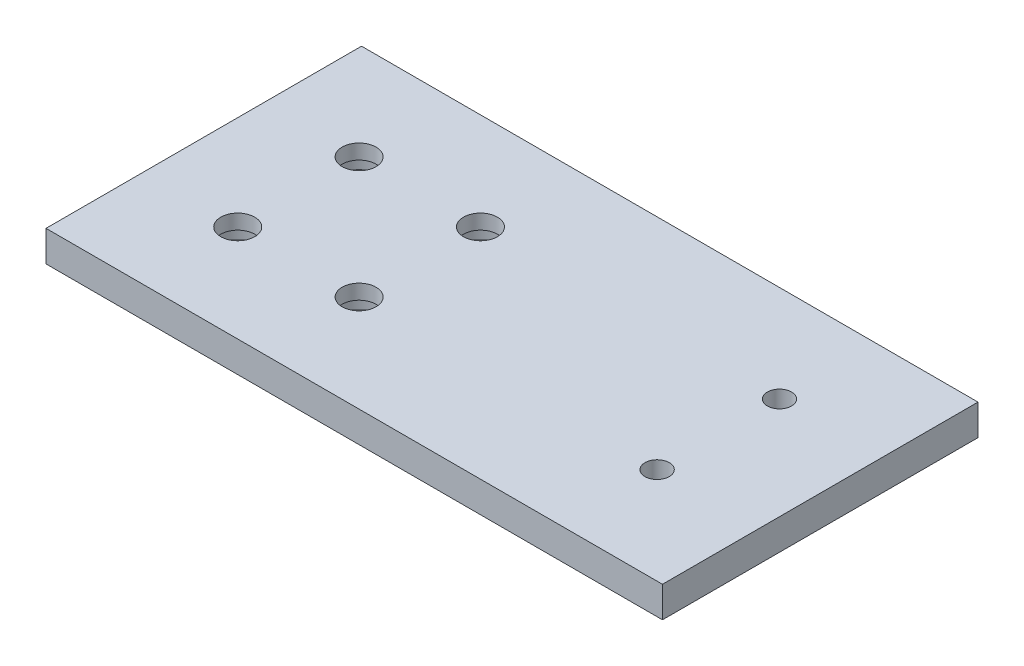
ISO-10303-21;
HEADER;
FILE_DESCRIPTION(('STEP AP214'),'2;1');
FILE_NAME('part.step','',(''),(''),'','','');
FILE_SCHEMA(('AUTOMOTIVE_DESIGN { 1 0 10303 214 1 1 1 1 }'));
ENDSEC;
DATA;
#1=APPLICATION_CONTEXT('core data for automotive mechanical design processes');
#2=APPLICATION_PROTOCOL_DEFINITION('international standard','automotive_design',2000,#1);
#3=PRODUCT_CONTEXT('',#1,'mechanical');
#4=PRODUCT('Part','Part','',(#3));
#5=PRODUCT_RELATED_PRODUCT_CATEGORY('part','',(#4));
#6=PRODUCT_DEFINITION_FORMATION('','',#4);
#7=PRODUCT_DEFINITION_CONTEXT('part definition',#1,'design');
#8=PRODUCT_DEFINITION('design','',#6,#7);
#9=PRODUCT_DEFINITION_SHAPE('','',#8);
#10=(LENGTH_UNIT() NAMED_UNIT(*) SI_UNIT(.MILLI.,.METRE.));
#11=(NAMED_UNIT(*) PLANE_ANGLE_UNIT() SI_UNIT($,.RADIAN.));
#12=(NAMED_UNIT(*) SI_UNIT($,.STERADIAN.) SOLID_ANGLE_UNIT());
#13=UNCERTAINTY_MEASURE_WITH_UNIT(LENGTH_MEASURE(1.E-05),#10,'distance_accuracy_value','');
#14=(GEOMETRIC_REPRESENTATION_CONTEXT(3) GLOBAL_UNCERTAINTY_ASSIGNED_CONTEXT((#13)) GLOBAL_UNIT_ASSIGNED_CONTEXT((#10,
#11,#12)) REPRESENTATION_CONTEXT('',''));
#15=CARTESIAN_POINT('',(0.,0.,0.));
#16=DIRECTION('',(0.,0.,1.));
#17=DIRECTION('',(1.,0.,0.));
#18=AXIS2_PLACEMENT_3D('',#15,#16,#17);
#19=CARTESIAN_POINT('',(-63.5,6.35,-32.5));
#20=DIRECTION('',(1.,0.,0.));
#21=DIRECTION('',(0.,0.,-1.));
#22=AXIS2_PLACEMENT_3D('',#19,#20,#21);
#23=PLANE('',#22);
#24=DIRECTION('',(0.,0.,1.));
#25=VECTOR('',#24,1.);
#26=CARTESIAN_POINT('',(-63.5,0.,-32.5));
#27=LINE('',#26,#25);
#28=CARTESIAN_POINT('',(-63.5,0.,-32.5));
#29=VERTEX_POINT('',#28);
#30=CARTESIAN_POINT('',(-63.5,0.,32.5));
#31=VERTEX_POINT('',#30);
#32=EDGE_CURVE('E94',#29,#31,#27,.T.);
#33=ORIENTED_EDGE('',*,*,#32,.T.);
#34=DIRECTION('',(0.,-1.,0.));
#35=VECTOR('',#34,1.);
#36=CARTESIAN_POINT('',(-63.5,6.35,32.5));
#37=LINE('',#36,#35);
#38=CARTESIAN_POINT('',(-63.5,6.35,32.5));
#39=VERTEX_POINT('',#38);
#40=EDGE_CURVE('E11',#39,#31,#37,.T.);
#41=ORIENTED_EDGE('',*,*,#40,.F.);
#42=DIRECTION('',(0.,0.,1.));
#43=VECTOR('',#42,1.);
#44=CARTESIAN_POINT('',(-63.5,6.35,-32.5));
#45=LINE('',#44,#43);
#46=CARTESIAN_POINT('',(-63.5,6.35,-32.5));
#47=VERTEX_POINT('',#46);
#48=EDGE_CURVE('E82',#47,#39,#45,.T.);
#49=ORIENTED_EDGE('',*,*,#48,.F.);
#50=DIRECTION('',(0.,-1.,0.));
#51=VECTOR('',#50,1.);
#52=CARTESIAN_POINT('',(-63.5,6.35,-32.5));
#53=LINE('',#52,#51);
#54=EDGE_CURVE('E90',#47,#29,#53,.T.);
#55=ORIENTED_EDGE('',*,*,#54,.T.);
#56=EDGE_LOOP('',(#33,#41,#49,#55));
#57=FACE_BOUND('',#56,.T.);
#58=ADVANCED_FACE('F31',(#57),#23,.F.);
#59=CARTESIAN_POINT('',(-63.5,6.35,32.5));
#60=DIRECTION('',(0.,0.,-1.));
#61=DIRECTION('',(-1.,0.,0.));
#62=AXIS2_PLACEMENT_3D('',#59,#60,#61);
#63=PLANE('',#62);
#64=DIRECTION('',(1.,0.,0.));
#65=VECTOR('',#64,1.);
#66=CARTESIAN_POINT('',(-63.5,0.,32.5));
#67=LINE('',#66,#65);
#68=CARTESIAN_POINT('',(63.5,0.,32.5));
#69=VERTEX_POINT('',#68);
#70=EDGE_CURVE('E86',#31,#69,#67,.T.);
#71=ORIENTED_EDGE('',*,*,#70,.T.);
#72=DIRECTION('',(0.,-1.,0.));
#73=VECTOR('',#72,1.);
#74=CARTESIAN_POINT('',(63.5,6.35,32.5));
#75=LINE('',#74,#73);
#76=CARTESIAN_POINT('',(63.5,6.35,32.5));
#77=VERTEX_POINT('',#76);
#78=EDGE_CURVE('E39',#77,#69,#75,.T.);
#79=ORIENTED_EDGE('',*,*,#78,.F.);
#80=DIRECTION('',(1.,0.,0.));
#81=VECTOR('',#80,1.);
#82=CARTESIAN_POINT('',(-63.5,6.35,32.5));
#83=LINE('',#82,#81);
#84=EDGE_CURVE('E77',#39,#77,#83,.T.);
#85=ORIENTED_EDGE('',*,*,#84,.F.);
#86=ORIENTED_EDGE('',*,*,#40,.T.);
#87=EDGE_LOOP('',(#71,#79,#85,#86));
#88=FACE_BOUND('',#87,.T.);
#89=ADVANCED_FACE('F85',(#88),#63,.F.);
#90=CARTESIAN_POINT('',(63.5,6.35,-32.5));
#91=DIRECTION('',(-1.,0.,0.));
#92=DIRECTION('',(0.,0.,1.));
#93=AXIS2_PLACEMENT_3D('',#90,#91,#92);
#94=PLANE('',#93);
#95=DIRECTION('',(0.,0.,-1.));
#96=VECTOR('',#95,1.);
#97=CARTESIAN_POINT('',(63.5,0.,-32.5));
#98=LINE('',#97,#96);
#99=CARTESIAN_POINT('',(63.5,0.,-32.5));
#100=VERTEX_POINT('',#99);
#101=EDGE_CURVE('E64',#69,#100,#98,.T.);
#102=ORIENTED_EDGE('',*,*,#101,.T.);
#103=DIRECTION('',(0.,-1.,0.));
#104=VECTOR('',#103,1.);
#105=CARTESIAN_POINT('',(63.5,6.35,-32.5));
#106=LINE('',#105,#104);
#107=CARTESIAN_POINT('',(63.5,6.35,-32.5));
#108=VERTEX_POINT('',#107);
#109=EDGE_CURVE('E87',#108,#100,#106,.T.);
#110=ORIENTED_EDGE('',*,*,#109,.F.);
#111=DIRECTION('',(0.,0.,-1.));
#112=VECTOR('',#111,1.);
#113=CARTESIAN_POINT('',(63.5,6.35,-32.5));
#114=LINE('',#113,#112);
#115=EDGE_CURVE('E80',#77,#108,#114,.T.);
#116=ORIENTED_EDGE('',*,*,#115,.F.);
#117=ORIENTED_EDGE('',*,*,#78,.T.);
#118=EDGE_LOOP('',(#102,#110,#116,#117));
#119=FACE_BOUND('',#118,.T.);
#120=ADVANCED_FACE('F88',(#119),#94,.F.);
#121=CARTESIAN_POINT('',(-63.5,6.35,-32.5));
#122=DIRECTION('',(0.,0.,1.));
#123=DIRECTION('',(1.,0.,0.));
#124=AXIS2_PLACEMENT_3D('',#121,#122,#123);
#125=PLANE('',#124);
#126=DIRECTION('',(-1.,0.,0.));
#127=VECTOR('',#126,1.);
#128=CARTESIAN_POINT('',(-63.5,0.,-32.5));
#129=LINE('',#128,#127);
#130=EDGE_CURVE('E70',#100,#29,#129,.T.);
#131=ORIENTED_EDGE('',*,*,#130,.T.);
#132=ORIENTED_EDGE('',*,*,#54,.F.);
#133=DIRECTION('',(-1.,0.,0.));
#134=VECTOR('',#133,1.);
#135=CARTESIAN_POINT('',(-63.5,6.35,-32.5));
#136=LINE('',#135,#134);
#137=EDGE_CURVE('E47',#108,#47,#136,.T.);
#138=ORIENTED_EDGE('',*,*,#137,.F.);
#139=ORIENTED_EDGE('',*,*,#109,.T.);
#140=EDGE_LOOP('',(#131,#132,#138,#139));
#141=FACE_BOUND('',#140,.T.);
#142=ADVANCED_FACE('F102',(#141),#125,.F.);
#143=CARTESIAN_POINT('',(-63.5,6.35,32.5));
#144=DIRECTION('',(0.,1.,0.));
#145=DIRECTION('',(0.,0.,1.));
#146=AXIS2_PLACEMENT_3D('',#143,#144,#145);
#147=PLANE('',#146);
#148=CARTESIAN_POINT('',(-44.0000000000004,6.35,12.5000000000051));
#149=DIRECTION('',(0.,-1.,0.));
#150=DIRECTION('',(0.,0.,-1.));
#151=AXIS2_PLACEMENT_3D('',#148,#149,#150);
#152=CIRCLE('',#151,3.5);
#153=CARTESIAN_POINT('',(-44.0000000000004,6.35,9.00000000000507));
#154=VERTEX_POINT('',#153);
#155=EDGE_CURVE('E155',#154,#154,#152,.T.);
#156=ORIENTED_EDGE('',*,*,#155,.T.);
#157=EDGE_LOOP('',(#156));
#158=FACE_BOUND('',#157,.T.);
#159=CARTESIAN_POINT('',(-19.0000000000004,6.35,12.5000000000053));
#160=DIRECTION('',(0.,-1.,0.));
#161=DIRECTION('',(0.,0.,-1.));
#162=AXIS2_PLACEMENT_3D('',#159,#160,#161);
#163=CIRCLE('',#162,3.5);
#164=CARTESIAN_POINT('',(-19.0000000000004,6.35,9.00000000000527));
#165=VERTEX_POINT('',#164);
#166=EDGE_CURVE('E143',#165,#165,#163,.T.);
#167=ORIENTED_EDGE('',*,*,#166,.T.);
#168=EDGE_LOOP('',(#167));
#169=FACE_BOUND('',#168,.T.);
#170=CARTESIAN_POINT('',(-19.0000000000002,6.35,-12.4999999999947));
#171=DIRECTION('',(0.,-1.,0.));
#172=DIRECTION('',(0.,0.,-1.));
#173=AXIS2_PLACEMENT_3D('',#170,#171,#172);
#174=CIRCLE('',#173,3.5);
#175=CARTESIAN_POINT('',(-19.0000000000002,6.35,-15.9999999999947));
#176=VERTEX_POINT('',#175);
#177=EDGE_CURVE('E131',#176,#176,#174,.T.);
#178=ORIENTED_EDGE('',*,*,#177,.T.);
#179=EDGE_LOOP('',(#178));
#180=FACE_BOUND('',#179,.T.);
#181=CARTESIAN_POINT('',(-44.0000000000001,6.35,-12.499999999995));
#182=DIRECTION('',(0.,-1.,0.));
#183=DIRECTION('',(0.,0.,-1.));
#184=AXIS2_PLACEMENT_3D('',#181,#182,#183);
#185=CIRCLE('',#184,3.5);
#186=CARTESIAN_POINT('',(-44.0000000000001,6.35,-15.9999999999949));
#187=VERTEX_POINT('',#186);
#188=EDGE_CURVE('E119',#187,#187,#185,.T.);
#189=ORIENTED_EDGE('',*,*,#188,.T.);
#190=EDGE_LOOP('',(#189));
#191=FACE_BOUND('',#190,.T.);
#192=CARTESIAN_POINT('',(42.4999999999867,6.35,-12.5999999999944));
#193=DIRECTION('',(0.,1.,0.));
#194=DIRECTION('',(0.,0.,1.));
#195=AXIS2_PLACEMENT_3D('',#192,#193,#194);
#196=CIRCLE('',#195,2.5);
#197=CARTESIAN_POINT('',(42.4999999999867,6.35,-10.0999999999944));
#198=VERTEX_POINT('',#197);
#199=EDGE_CURVE('E116',#198,#198,#196,.T.);
#200=ORIENTED_EDGE('',*,*,#199,.F.);
#201=EDGE_LOOP('',(#200));
#202=FACE_BOUND('',#201,.T.);
#203=CARTESIAN_POINT('',(42.4999999999868,6.35,12.6000000000056));
#204=DIRECTION('',(0.,1.,0.));
#205=DIRECTION('',(0.,0.,1.));
#206=AXIS2_PLACEMENT_3D('',#203,#204,#205);
#207=CIRCLE('',#206,2.5);
#208=CARTESIAN_POINT('',(42.4999999999868,6.35,15.1000000000056));
#209=VERTEX_POINT('',#208);
#210=EDGE_CURVE('E110',#209,#209,#207,.T.);
#211=ORIENTED_EDGE('',*,*,#210,.F.);
#212=EDGE_LOOP('',(#211));
#213=FACE_BOUND('',#212,.T.);
#214=ORIENTED_EDGE('',*,*,#48,.T.);
#215=ORIENTED_EDGE('',*,*,#84,.T.);
#216=ORIENTED_EDGE('',*,*,#115,.T.);
#217=ORIENTED_EDGE('',*,*,#137,.T.);
#218=EDGE_LOOP('',(#214,#215,#216,#217));
#219=FACE_BOUND('',#218,.T.);
#220=ADVANCED_FACE('F78',(#158,#169,#180,#191,#202,#213,#219),#147,.T.);
#221=CARTESIAN_POINT('',(-63.5,0.,32.5));
#222=DIRECTION('',(0.,1.,0.));
#223=DIRECTION('',(0.,0.,1.));
#224=AXIS2_PLACEMENT_3D('',#221,#222,#223);
#225=PLANE('',#224);
#226=CARTESIAN_POINT('',(-44.0000000000004,0.,12.5000000000051));
#227=DIRECTION('',(0.,-1.,0.));
#228=DIRECTION('',(0.,0.,-1.));
#229=AXIS2_PLACEMENT_3D('',#226,#227,#228);
#230=CIRCLE('',#229,5.75);
#231=CARTESIAN_POINT('',(-44.0000000000004,0.,6.75000000000506));
#232=VERTEX_POINT('',#231);
#233=EDGE_CURVE('E164',#232,#232,#230,.T.);
#234=ORIENTED_EDGE('',*,*,#233,.F.);
#235=EDGE_LOOP('',(#234));
#236=FACE_BOUND('',#235,.T.);
#237=CARTESIAN_POINT('',(-19.0000000000004,0.,12.5000000000053));
#238=DIRECTION('',(0.,-1.,0.));
#239=DIRECTION('',(0.,0.,-1.));
#240=AXIS2_PLACEMENT_3D('',#237,#238,#239);
#241=CIRCLE('',#240,5.75);
#242=CARTESIAN_POINT('',(-19.0000000000004,0.,6.75000000000527));
#243=VERTEX_POINT('',#242);
#244=EDGE_CURVE('E152',#243,#243,#241,.T.);
#245=ORIENTED_EDGE('',*,*,#244,.F.);
#246=EDGE_LOOP('',(#245));
#247=FACE_BOUND('',#246,.T.);
#248=CARTESIAN_POINT('',(-19.0000000000002,0.,-12.4999999999947));
#249=DIRECTION('',(0.,-1.,0.));
#250=DIRECTION('',(0.,0.,-1.));
#251=AXIS2_PLACEMENT_3D('',#248,#249,#250);
#252=CIRCLE('',#251,5.75);
#253=CARTESIAN_POINT('',(-19.0000000000002,0.,-18.2499999999947));
#254=VERTEX_POINT('',#253);
#255=EDGE_CURVE('E140',#254,#254,#252,.T.);
#256=ORIENTED_EDGE('',*,*,#255,.F.);
#257=EDGE_LOOP('',(#256));
#258=FACE_BOUND('',#257,.T.);
#259=CARTESIAN_POINT('',(-44.0000000000001,0.,-12.499999999995));
#260=DIRECTION('',(0.,-1.,0.));
#261=DIRECTION('',(0.,0.,-1.));
#262=AXIS2_PLACEMENT_3D('',#259,#260,#261);
#263=CIRCLE('',#262,5.75);
#264=CARTESIAN_POINT('',(-44.0000000000001,0.,-18.249999999995));
#265=VERTEX_POINT('',#264);
#266=EDGE_CURVE('E128',#265,#265,#263,.T.);
#267=ORIENTED_EDGE('',*,*,#266,.F.);
#268=EDGE_LOOP('',(#267));
#269=FACE_BOUND('',#268,.T.);
#270=CARTESIAN_POINT('',(42.4999999999867,0.,-12.5999999999944));
#271=DIRECTION('',(0.,1.,0.));
#272=DIRECTION('',(0.,0.,1.));
#273=AXIS2_PLACEMENT_3D('',#270,#271,#272);
#274=CIRCLE('',#273,2.5);
#275=CARTESIAN_POINT('',(42.4999999999867,0.,-10.0999999999944));
#276=VERTEX_POINT('',#275);
#277=EDGE_CURVE('E113',#276,#276,#274,.T.);
#278=ORIENTED_EDGE('',*,*,#277,.T.);
#279=EDGE_LOOP('',(#278));
#280=FACE_BOUND('',#279,.T.);
#281=CARTESIAN_POINT('',(42.4999999999868,0.,12.6000000000056));
#282=DIRECTION('',(0.,1.,0.));
#283=DIRECTION('',(0.,0.,1.));
#284=AXIS2_PLACEMENT_3D('',#281,#282,#283);
#285=CIRCLE('',#284,2.5);
#286=CARTESIAN_POINT('',(42.4999999999868,0.,15.1000000000056));
#287=VERTEX_POINT('',#286);
#288=EDGE_CURVE('E97',#287,#287,#285,.T.);
#289=ORIENTED_EDGE('',*,*,#288,.T.);
#290=EDGE_LOOP('',(#289));
#291=FACE_BOUND('',#290,.T.);
#292=ORIENTED_EDGE('',*,*,#32,.F.);
#293=ORIENTED_EDGE('',*,*,#130,.F.);
#294=ORIENTED_EDGE('',*,*,#101,.F.);
#295=ORIENTED_EDGE('',*,*,#70,.F.);
#296=EDGE_LOOP('',(#292,#293,#294,#295));
#297=FACE_BOUND('',#296,.T.);
#298=ADVANCED_FACE('F105',(#236,#247,#258,#269,#280,#291,#297),#225,.F.);
#299=CARTESIAN_POINT('',(42.4999999999868,6.35,12.6000000000056));
#300=DIRECTION('',(0.,1.,0.));
#301=DIRECTION('',(0.,0.,1.));
#302=AXIS2_PLACEMENT_3D('',#299,#300,#301);
#303=CYLINDRICAL_SURFACE('',#302,2.5);
#304=ORIENTED_EDGE('',*,*,#288,.F.);
#305=EDGE_LOOP('',(#304));
#306=FACE_BOUND('',#305,.T.);
#307=ORIENTED_EDGE('',*,*,#210,.T.);
#308=EDGE_LOOP('',(#307));
#309=FACE_BOUND('',#308,.T.);
#310=ADVANCED_FACE('F172',(#306,#309),#303,.F.);
#311=CARTESIAN_POINT('',(42.4999999999867,6.35,-12.5999999999944));
#312=DIRECTION('',(0.,1.,0.));
#313=DIRECTION('',(0.,0.,1.));
#314=AXIS2_PLACEMENT_3D('',#311,#312,#313);
#315=CYLINDRICAL_SURFACE('',#314,2.5);
#316=ORIENTED_EDGE('',*,*,#277,.F.);
#317=EDGE_LOOP('',(#316));
#318=FACE_BOUND('',#317,.T.);
#319=ORIENTED_EDGE('',*,*,#199,.T.);
#320=EDGE_LOOP('',(#319));
#321=FACE_BOUND('',#320,.T.);
#322=ADVANCED_FACE('F186',(#318,#321),#315,.F.);
#323=CARTESIAN_POINT('',(-44.0000000000001,0.,-12.499999999995));
#324=DIRECTION('',(0.,-1.,0.));
#325=DIRECTION('',(0.,0.,-1.));
#326=AXIS2_PLACEMENT_3D('',#323,#324,#325);
#327=CYLINDRICAL_SURFACE('',#326,3.5);
#328=ORIENTED_EDGE('',*,*,#188,.F.);
#329=EDGE_LOOP('',(#328));
#330=FACE_BOUND('',#329,.T.);
#331=CARTESIAN_POINT('',(-44.0000000000001,3.3,-12.499999999995));
#332=DIRECTION('',(0.,-1.,0.));
#333=DIRECTION('',(0.,0.,-1.));
#334=AXIS2_PLACEMENT_3D('',#331,#332,#333);
#335=CIRCLE('',#334,3.5);
#336=CARTESIAN_POINT('',(-44.0000000000001,3.3,-15.999999999995));
#337=VERTEX_POINT('',#336);
#338=EDGE_CURVE('E122',#337,#337,#335,.T.);
#339=ORIENTED_EDGE('',*,*,#338,.T.);
#340=EDGE_LOOP('',(#339));
#341=FACE_BOUND('',#340,.T.);
#342=ADVANCED_FACE('F228',(#330,#341),#327,.F.);
#343=CARTESIAN_POINT('',(-40.5000000000001,3.3,-12.499999999995));
#344=DIRECTION('',(0.,1.,0.));
#345=DIRECTION('',(0.,0.,1.));
#346=AXIS2_PLACEMENT_3D('',#343,#344,#345);
#347=PLANE('',#346);
#348=ORIENTED_EDGE('',*,*,#338,.F.);
#349=EDGE_LOOP('',(#348));
#350=FACE_BOUND('',#349,.T.);
#351=CARTESIAN_POINT('',(-44.0000000000001,3.3,-12.499999999995));
#352=DIRECTION('',(0.,-1.,0.));
#353=DIRECTION('',(0.,0.,-1.));
#354=AXIS2_PLACEMENT_3D('',#351,#352,#353);
#355=CIRCLE('',#354,5.75);
#356=CARTESIAN_POINT('',(-44.0000000000001,3.3,-18.249999999995));
#357=VERTEX_POINT('',#356);
#358=EDGE_CURVE('E125',#357,#357,#355,.T.);
#359=ORIENTED_EDGE('',*,*,#358,.T.);
#360=EDGE_LOOP('',(#359));
#361=FACE_BOUND('',#360,.T.);
#362=ADVANCED_FACE('F247',(#350,#361),#347,.F.);
#363=CARTESIAN_POINT('',(-44.0000000000001,0.,-12.499999999995));
#364=DIRECTION('',(0.,-1.,0.));
#365=DIRECTION('',(0.,0.,-1.));
#366=AXIS2_PLACEMENT_3D('',#363,#364,#365);
#367=CYLINDRICAL_SURFACE('',#366,5.75);
#368=ORIENTED_EDGE('',*,*,#358,.F.);
#369=EDGE_LOOP('',(#368));
#370=FACE_BOUND('',#369,.T.);
#371=ORIENTED_EDGE('',*,*,#266,.T.);
#372=EDGE_LOOP('',(#371));
#373=FACE_BOUND('',#372,.T.);
#374=ADVANCED_FACE('F257',(#370,#373),#367,.F.);
#375=CARTESIAN_POINT('',(-19.0000000000002,0.,-12.4999999999947));
#376=DIRECTION('',(0.,-1.,0.));
#377=DIRECTION('',(0.,0.,-1.));
#378=AXIS2_PLACEMENT_3D('',#375,#376,#377);
#379=CYLINDRICAL_SURFACE('',#378,3.5);
#380=ORIENTED_EDGE('',*,*,#177,.F.);
#381=EDGE_LOOP('',(#380));
#382=FACE_BOUND('',#381,.T.);
#383=CARTESIAN_POINT('',(-19.0000000000002,3.3,-12.4999999999947));
#384=DIRECTION('',(0.,-1.,0.));
#385=DIRECTION('',(0.,0.,-1.));
#386=AXIS2_PLACEMENT_3D('',#383,#384,#385);
#387=CIRCLE('',#386,3.5);
#388=CARTESIAN_POINT('',(-19.0000000000002,3.3,-15.9999999999947));
#389=VERTEX_POINT('',#388);
#390=EDGE_CURVE('E134',#389,#389,#387,.T.);
#391=ORIENTED_EDGE('',*,*,#390,.T.);
#392=EDGE_LOOP('',(#391));
#393=FACE_BOUND('',#392,.T.);
#394=ADVANCED_FACE('F267',(#382,#393),#379,.F.);
#395=CARTESIAN_POINT('',(-15.5000000000002,3.3,-12.4999999999947));
#396=DIRECTION('',(0.,1.,0.));
#397=DIRECTION('',(0.,0.,1.));
#398=AXIS2_PLACEMENT_3D('',#395,#396,#397);
#399=PLANE('',#398);
#400=ORIENTED_EDGE('',*,*,#390,.F.);
#401=EDGE_LOOP('',(#400));
#402=FACE_BOUND('',#401,.T.);
#403=CARTESIAN_POINT('',(-19.0000000000002,3.3,-12.4999999999947));
#404=DIRECTION('',(0.,-1.,0.));
#405=DIRECTION('',(0.,0.,-1.));
#406=AXIS2_PLACEMENT_3D('',#403,#404,#405);
#407=CIRCLE('',#406,5.75);
#408=CARTESIAN_POINT('',(-19.0000000000002,3.3,-18.2499999999947));
#409=VERTEX_POINT('',#408);
#410=EDGE_CURVE('E137',#409,#409,#407,.T.);
#411=ORIENTED_EDGE('',*,*,#410,.T.);
#412=EDGE_LOOP('',(#411));
#413=FACE_BOUND('',#412,.T.);
#414=ADVANCED_FACE('F277',(#402,#413),#399,.F.);
#415=CARTESIAN_POINT('',(-19.0000000000002,0.,-12.4999999999947));
#416=DIRECTION('',(0.,-1.,0.));
#417=DIRECTION('',(0.,0.,-1.));
#418=AXIS2_PLACEMENT_3D('',#415,#416,#417);
#419=CYLINDRICAL_SURFACE('',#418,5.75);
#420=ORIENTED_EDGE('',*,*,#410,.F.);
#421=EDGE_LOOP('',(#420));
#422=FACE_BOUND('',#421,.T.);
#423=ORIENTED_EDGE('',*,*,#255,.T.);
#424=EDGE_LOOP('',(#423));
#425=FACE_BOUND('',#424,.T.);
#426=ADVANCED_FACE('F287',(#422,#425),#419,.F.);
#427=CARTESIAN_POINT('',(-19.0000000000004,0.,12.5000000000053));
#428=DIRECTION('',(0.,-1.,0.));
#429=DIRECTION('',(0.,0.,-1.));
#430=AXIS2_PLACEMENT_3D('',#427,#428,#429);
#431=CYLINDRICAL_SURFACE('',#430,3.5);
#432=ORIENTED_EDGE('',*,*,#166,.F.);
#433=EDGE_LOOP('',(#432));
#434=FACE_BOUND('',#433,.T.);
#435=CARTESIAN_POINT('',(-19.0000000000004,3.3,12.5000000000053));
#436=DIRECTION('',(0.,-1.,0.));
#437=DIRECTION('',(0.,0.,-1.));
#438=AXIS2_PLACEMENT_3D('',#435,#436,#437);
#439=CIRCLE('',#438,3.5);
#440=CARTESIAN_POINT('',(-19.0000000000004,3.3,9.00000000000527));
#441=VERTEX_POINT('',#440);
#442=EDGE_CURVE('E146',#441,#441,#439,.T.);
#443=ORIENTED_EDGE('',*,*,#442,.T.);
#444=EDGE_LOOP('',(#443));
#445=FACE_BOUND('',#444,.T.);
#446=ADVANCED_FACE('F297',(#434,#445),#431,.F.);
#447=CARTESIAN_POINT('',(-15.5000000000004,3.3,12.5000000000053));
#448=DIRECTION('',(0.,1.,0.));
#449=DIRECTION('',(0.,0.,1.));
#450=AXIS2_PLACEMENT_3D('',#447,#448,#449);
#451=PLANE('',#450);
#452=ORIENTED_EDGE('',*,*,#442,.F.);
#453=EDGE_LOOP('',(#452));
#454=FACE_BOUND('',#453,.T.);
#455=CARTESIAN_POINT('',(-19.0000000000004,3.3,12.5000000000053));
#456=DIRECTION('',(0.,-1.,0.));
#457=DIRECTION('',(0.,0.,-1.));
#458=AXIS2_PLACEMENT_3D('',#455,#456,#457);
#459=CIRCLE('',#458,5.75);
#460=CARTESIAN_POINT('',(-19.0000000000004,3.3,6.75000000000527));
#461=VERTEX_POINT('',#460);
#462=EDGE_CURVE('E149',#461,#461,#459,.T.);
#463=ORIENTED_EDGE('',*,*,#462,.T.);
#464=EDGE_LOOP('',(#463));
#465=FACE_BOUND('',#464,.T.);
#466=ADVANCED_FACE('F307',(#454,#465),#451,.F.);
#467=CARTESIAN_POINT('',(-19.0000000000004,0.,12.5000000000053));
#468=DIRECTION('',(0.,-1.,0.));
#469=DIRECTION('',(0.,0.,-1.));
#470=AXIS2_PLACEMENT_3D('',#467,#468,#469);
#471=CYLINDRICAL_SURFACE('',#470,5.75);
#472=ORIENTED_EDGE('',*,*,#462,.F.);
#473=EDGE_LOOP('',(#472));
#474=FACE_BOUND('',#473,.T.);
#475=ORIENTED_EDGE('',*,*,#244,.T.);
#476=EDGE_LOOP('',(#475));
#477=FACE_BOUND('',#476,.T.);
#478=ADVANCED_FACE('F317',(#474,#477),#471,.F.);
#479=CARTESIAN_POINT('',(-44.0000000000004,0.,12.5000000000051));
#480=DIRECTION('',(0.,-1.,0.));
#481=DIRECTION('',(0.,0.,-1.));
#482=AXIS2_PLACEMENT_3D('',#479,#480,#481);
#483=CYLINDRICAL_SURFACE('',#482,3.5);
#484=ORIENTED_EDGE('',*,*,#155,.F.);
#485=EDGE_LOOP('',(#484));
#486=FACE_BOUND('',#485,.T.);
#487=CARTESIAN_POINT('',(-44.0000000000004,3.3,12.5000000000051));
#488=DIRECTION('',(0.,-1.,0.));
#489=DIRECTION('',(0.,0.,-1.));
#490=AXIS2_PLACEMENT_3D('',#487,#488,#489);
#491=CIRCLE('',#490,3.5);
#492=CARTESIAN_POINT('',(-44.0000000000004,3.3,9.00000000000506));
#493=VERTEX_POINT('',#492);
#494=EDGE_CURVE('E158',#493,#493,#491,.T.);
#495=ORIENTED_EDGE('',*,*,#494,.T.);
#496=EDGE_LOOP('',(#495));
#497=FACE_BOUND('',#496,.T.);
#498=ADVANCED_FACE('F327',(#486,#497),#483,.F.);
#499=CARTESIAN_POINT('',(-40.5000000000004,3.3,12.5000000000051));
#500=DIRECTION('',(0.,1.,0.));
#501=DIRECTION('',(0.,0.,1.));
#502=AXIS2_PLACEMENT_3D('',#499,#500,#501);
#503=PLANE('',#502);
#504=ORIENTED_EDGE('',*,*,#494,.F.);
#505=EDGE_LOOP('',(#504));
#506=FACE_BOUND('',#505,.T.);
#507=CARTESIAN_POINT('',(-44.0000000000004,3.3,12.5000000000051));
#508=DIRECTION('',(0.,-1.,0.));
#509=DIRECTION('',(0.,0.,-1.));
#510=AXIS2_PLACEMENT_3D('',#507,#508,#509);
#511=CIRCLE('',#510,5.75);
#512=CARTESIAN_POINT('',(-44.0000000000004,3.3,6.75000000000506));
#513=VERTEX_POINT('',#512);
#514=EDGE_CURVE('E161',#513,#513,#511,.T.);
#515=ORIENTED_EDGE('',*,*,#514,.T.);
#516=EDGE_LOOP('',(#515));
#517=FACE_BOUND('',#516,.T.);
#518=ADVANCED_FACE('F337',(#506,#517),#503,.F.);
#519=CARTESIAN_POINT('',(-44.0000000000004,0.,12.5000000000051));
#520=DIRECTION('',(0.,-1.,0.));
#521=DIRECTION('',(0.,0.,-1.));
#522=AXIS2_PLACEMENT_3D('',#519,#520,#521);
#523=CYLINDRICAL_SURFACE('',#522,5.75);
#524=ORIENTED_EDGE('',*,*,#514,.F.);
#525=EDGE_LOOP('',(#524));
#526=FACE_BOUND('',#525,.T.);
#527=ORIENTED_EDGE('',*,*,#233,.T.);
#528=EDGE_LOOP('',(#527));
#529=FACE_BOUND('',#528,.T.);
#530=ADVANCED_FACE('F168',(#526,#529),#523,.F.);
#531=CLOSED_SHELL('',(#58,#89,#120,#142,#220,#298,#310,#322,#342,#362,#374,#394,#414,#426,#446,
#466,#478,#498,#518,#530));
#532=MANIFOLD_SOLID_BREP('B2',#531);
#533=ADVANCED_BREP_SHAPE_REPRESENTATION('',(#18,#532),#14);
#534=SHAPE_DEFINITION_REPRESENTATION(#9,#533);
ENDSEC;
END-ISO-10303-21;
